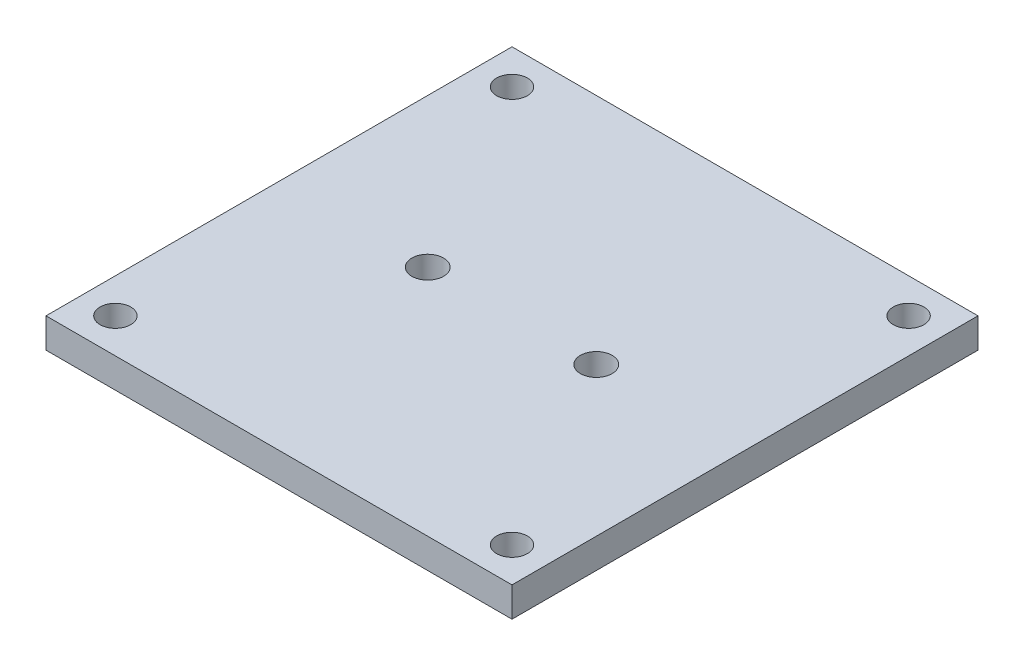
ISO-10303-21;
HEADER;
FILE_DESCRIPTION(('STEP AP214'),'2;1');
FILE_NAME('part.step','',(''),(''),'','','');
FILE_SCHEMA(('AUTOMOTIVE_DESIGN { 1 0 10303 214 1 1 1 1 }'));
ENDSEC;
DATA;
#1=APPLICATION_CONTEXT('core data for automotive mechanical design processes');
#2=APPLICATION_PROTOCOL_DEFINITION('international standard','automotive_design',2000,#1);
#3=PRODUCT_CONTEXT('',#1,'mechanical');
#4=PRODUCT('Part','Part','',(#3));
#5=PRODUCT_RELATED_PRODUCT_CATEGORY('part','',(#4));
#6=PRODUCT_DEFINITION_FORMATION('','',#4);
#7=PRODUCT_DEFINITION_CONTEXT('part definition',#1,'design');
#8=PRODUCT_DEFINITION('design','',#6,#7);
#9=PRODUCT_DEFINITION_SHAPE('','',#8);
#10=(LENGTH_UNIT() NAMED_UNIT(*) SI_UNIT(.MILLI.,.METRE.));
#11=(NAMED_UNIT(*) PLANE_ANGLE_UNIT() SI_UNIT($,.RADIAN.));
#12=(NAMED_UNIT(*) SI_UNIT($,.STERADIAN.) SOLID_ANGLE_UNIT());
#13=UNCERTAINTY_MEASURE_WITH_UNIT(LENGTH_MEASURE(1.E-05),#10,'distance_accuracy_value','');
#14=(GEOMETRIC_REPRESENTATION_CONTEXT(3) GLOBAL_UNCERTAINTY_ASSIGNED_CONTEXT((#13)) GLOBAL_UNIT_ASSIGNED_CONTEXT((#10,
#11,#12)) REPRESENTATION_CONTEXT('',''));
#15=CARTESIAN_POINT('',(0.,0.,0.));
#16=DIRECTION('',(0.,0.,1.));
#17=DIRECTION('',(1.,0.,0.));
#18=AXIS2_PLACEMENT_3D('',#15,#16,#17);
#19=CARTESIAN_POINT('',(23.5,3.,-23.5));
#20=DIRECTION('',(-1.,0.,0.));
#21=DIRECTION('',(0.,0.,1.));
#22=AXIS2_PLACEMENT_3D('',#19,#20,#21);
#23=PLANE('',#22);
#24=DIRECTION('',(0.,0.,-1.));
#25=VECTOR('',#24,1.);
#26=CARTESIAN_POINT('',(23.5,0.,-23.5));
#27=LINE('',#26,#25);
#28=CARTESIAN_POINT('',(23.5,0.,23.5));
#29=VERTEX_POINT('',#28);
#30=CARTESIAN_POINT('',(23.5,0.,-23.5));
#31=VERTEX_POINT('',#30);
#32=EDGE_CURVE('E96',#29,#31,#27,.T.);
#33=ORIENTED_EDGE('',*,*,#32,.T.);
#34=DIRECTION('',(0.,-1.,0.));
#35=VECTOR('',#34,1.);
#36=CARTESIAN_POINT('',(23.5,3.,-23.5));
#37=LINE('',#36,#35);
#38=CARTESIAN_POINT('',(23.5,3.,-23.5));
#39=VERTEX_POINT('',#38);
#40=EDGE_CURVE('E11',#39,#31,#37,.T.);
#41=ORIENTED_EDGE('',*,*,#40,.F.);
#42=DIRECTION('',(0.,0.,-1.));
#43=VECTOR('',#42,1.);
#44=CARTESIAN_POINT('',(23.5,3.,-23.5));
#45=LINE('',#44,#43);
#46=CARTESIAN_POINT('',(23.5,3.,23.5));
#47=VERTEX_POINT('',#46);
#48=EDGE_CURVE('E84',#47,#39,#45,.T.);
#49=ORIENTED_EDGE('',*,*,#48,.F.);
#50=DIRECTION('',(0.,-1.,0.));
#51=VECTOR('',#50,1.);
#52=CARTESIAN_POINT('',(23.5,3.,23.5));
#53=LINE('',#52,#51);
#54=EDGE_CURVE('E92',#47,#29,#53,.T.);
#55=ORIENTED_EDGE('',*,*,#54,.T.);
#56=EDGE_LOOP('',(#33,#41,#49,#55));
#57=FACE_BOUND('',#56,.T.);
#58=ADVANCED_FACE('F33',(#57),#23,.F.);
#59=CARTESIAN_POINT('',(-23.5,3.,-23.5));
#60=DIRECTION('',(0.,0.,1.));
#61=DIRECTION('',(1.,0.,0.));
#62=AXIS2_PLACEMENT_3D('',#59,#60,#61);
#63=PLANE('',#62);
#64=DIRECTION('',(-1.,0.,0.));
#65=VECTOR('',#64,1.);
#66=CARTESIAN_POINT('',(-23.5,0.,-23.5));
#67=LINE('',#66,#65);
#68=CARTESIAN_POINT('',(-23.5,0.,-23.5));
#69=VERTEX_POINT('',#68);
#70=EDGE_CURVE('E88',#31,#69,#67,.T.);
#71=ORIENTED_EDGE('',*,*,#70,.T.);
#72=DIRECTION('',(0.,-1.,0.));
#73=VECTOR('',#72,1.);
#74=CARTESIAN_POINT('',(-23.5,3.,-23.5));
#75=LINE('',#74,#73);
#76=CARTESIAN_POINT('',(-23.5,3.,-23.5));
#77=VERTEX_POINT('',#76);
#78=EDGE_CURVE('E41',#77,#69,#75,.T.);
#79=ORIENTED_EDGE('',*,*,#78,.F.);
#80=DIRECTION('',(-1.,0.,0.));
#81=VECTOR('',#80,1.);
#82=CARTESIAN_POINT('',(-23.5,3.,-23.5));
#83=LINE('',#82,#81);
#84=EDGE_CURVE('E79',#39,#77,#83,.T.);
#85=ORIENTED_EDGE('',*,*,#84,.F.);
#86=ORIENTED_EDGE('',*,*,#40,.T.);
#87=EDGE_LOOP('',(#71,#79,#85,#86));
#88=FACE_BOUND('',#87,.T.);
#89=ADVANCED_FACE('F87',(#88),#63,.F.);
#90=CARTESIAN_POINT('',(-23.5,3.,-23.5));
#91=DIRECTION('',(1.,0.,0.));
#92=DIRECTION('',(0.,0.,-1.));
#93=AXIS2_PLACEMENT_3D('',#90,#91,#92);
#94=PLANE('',#93);
#95=DIRECTION('',(0.,0.,1.));
#96=VECTOR('',#95,1.);
#97=CARTESIAN_POINT('',(-23.5,0.,-23.5));
#98=LINE('',#97,#96);
#99=CARTESIAN_POINT('',(-23.5,0.,23.5));
#100=VERTEX_POINT('',#99);
#101=EDGE_CURVE('E66',#69,#100,#98,.T.);
#102=ORIENTED_EDGE('',*,*,#101,.T.);
#103=DIRECTION('',(0.,-1.,0.));
#104=VECTOR('',#103,1.);
#105=CARTESIAN_POINT('',(-23.5,3.,23.5));
#106=LINE('',#105,#104);
#107=CARTESIAN_POINT('',(-23.5,3.,23.5));
#108=VERTEX_POINT('',#107);
#109=EDGE_CURVE('E89',#108,#100,#106,.T.);
#110=ORIENTED_EDGE('',*,*,#109,.F.);
#111=DIRECTION('',(0.,0.,1.));
#112=VECTOR('',#111,1.);
#113=CARTESIAN_POINT('',(-23.5,3.,-23.5));
#114=LINE('',#113,#112);
#115=EDGE_CURVE('E82',#77,#108,#114,.T.);
#116=ORIENTED_EDGE('',*,*,#115,.F.);
#117=ORIENTED_EDGE('',*,*,#78,.T.);
#118=EDGE_LOOP('',(#102,#110,#116,#117));
#119=FACE_BOUND('',#118,.T.);
#120=ADVANCED_FACE('F90',(#119),#94,.F.);
#121=CARTESIAN_POINT('',(-23.5,3.,23.5));
#122=DIRECTION('',(0.,0.,-1.));
#123=DIRECTION('',(-1.,0.,0.));
#124=AXIS2_PLACEMENT_3D('',#121,#122,#123);
#125=PLANE('',#124);
#126=DIRECTION('',(1.,0.,0.));
#127=VECTOR('',#126,1.);
#128=CARTESIAN_POINT('',(-23.5,0.,23.5));
#129=LINE('',#128,#127);
#130=EDGE_CURVE('E72',#100,#29,#129,.T.);
#131=ORIENTED_EDGE('',*,*,#130,.T.);
#132=ORIENTED_EDGE('',*,*,#54,.F.);
#133=DIRECTION('',(1.,0.,0.));
#134=VECTOR('',#133,1.);
#135=CARTESIAN_POINT('',(-23.5,3.,23.5));
#136=LINE('',#135,#134);
#137=EDGE_CURVE('E49',#108,#47,#136,.T.);
#138=ORIENTED_EDGE('',*,*,#137,.F.);
#139=ORIENTED_EDGE('',*,*,#109,.T.);
#140=EDGE_LOOP('',(#131,#132,#138,#139));
#141=FACE_BOUND('',#140,.T.);
#142=ADVANCED_FACE('F104',(#141),#125,.F.);
#143=CARTESIAN_POINT('',(0.,3.,0.));
#144=DIRECTION('',(0.,1.,0.));
#145=DIRECTION('',(0.,0.,1.));
#146=AXIS2_PLACEMENT_3D('',#143,#144,#145);
#147=PLANE('',#146);
#148=CARTESIAN_POINT('',(-8.5,3.,0.));
#149=DIRECTION('',(0.,1.,0.));
#150=DIRECTION('',(0.,0.,1.));
#151=AXIS2_PLACEMENT_3D('',#148,#149,#150);
#152=CIRCLE('',#151,1.6);
#153=CARTESIAN_POINT('',(-8.5,3.,1.6));
#154=VERTEX_POINT('',#153);
#155=EDGE_CURVE('E140',#154,#154,#152,.T.);
#156=ORIENTED_EDGE('',*,*,#155,.F.);
#157=EDGE_LOOP('',(#156));
#158=FACE_BOUND('',#157,.T.);
#159=CARTESIAN_POINT('',(8.50000000000001,3.,0.));
#160=DIRECTION('',(0.,1.,0.));
#161=DIRECTION('',(0.,0.,-1.));
#162=AXIS2_PLACEMENT_3D('',#159,#160,#161);
#163=CIRCLE('',#162,1.6);
#164=CARTESIAN_POINT('',(8.50000000000001,3.,-1.6));
#165=VERTEX_POINT('',#164);
#166=EDGE_CURVE('E134',#165,#165,#163,.T.);
#167=ORIENTED_EDGE('',*,*,#166,.F.);
#168=EDGE_LOOP('',(#167));
#169=FACE_BOUND('',#168,.T.);
#170=CARTESIAN_POINT('',(-20.,3.,20.));
#171=DIRECTION('',(0.,-1.,0.));
#172=DIRECTION('',(0.,0.,1.));
#173=AXIS2_PLACEMENT_3D('',#170,#171,#172);
#174=CIRCLE('',#173,1.55);
#175=CARTESIAN_POINT('',(-20.,3.,21.55));
#176=VERTEX_POINT('',#175);
#177=EDGE_CURVE('E113',#176,#176,#174,.T.);
#178=ORIENTED_EDGE('',*,*,#177,.T.);
#179=EDGE_LOOP('',(#178));
#180=FACE_BOUND('',#179,.T.);
#181=CARTESIAN_POINT('',(20.,3.,-20.));
#182=DIRECTION('',(0.,-1.,0.));
#183=DIRECTION('',(0.,0.,1.));
#184=AXIS2_PLACEMENT_3D('',#181,#182,#183);
#185=CIRCLE('',#184,1.55);
#186=CARTESIAN_POINT('',(20.,3.,-18.45));
#187=VERTEX_POINT('',#186);
#188=EDGE_CURVE('E119',#187,#187,#185,.T.);
#189=ORIENTED_EDGE('',*,*,#188,.T.);
#190=EDGE_LOOP('',(#189));
#191=FACE_BOUND('',#190,.T.);
#192=CARTESIAN_POINT('',(-20.,3.,-20.));
#193=DIRECTION('',(0.,-1.,0.));
#194=DIRECTION('',(0.,0.,-1.));
#195=AXIS2_PLACEMENT_3D('',#192,#193,#194);
#196=CIRCLE('',#195,1.55);
#197=CARTESIAN_POINT('',(-20.,3.,-21.55));
#198=VERTEX_POINT('',#197);
#199=EDGE_CURVE('E120',#198,#198,#196,.T.);
#200=ORIENTED_EDGE('',*,*,#199,.T.);
#201=EDGE_LOOP('',(#200));
#202=FACE_BOUND('',#201,.T.);
#203=CARTESIAN_POINT('',(20.,3.,20.));
#204=DIRECTION('',(0.,-1.,0.));
#205=DIRECTION('',(0.,0.,-1.));
#206=AXIS2_PLACEMENT_3D('',#203,#204,#205);
#207=CIRCLE('',#206,1.55);
#208=CARTESIAN_POINT('',(20.,3.,18.45));
#209=VERTEX_POINT('',#208);
#210=EDGE_CURVE('E99',#209,#209,#207,.T.);
#211=ORIENTED_EDGE('',*,*,#210,.T.);
#212=EDGE_LOOP('',(#211));
#213=FACE_BOUND('',#212,.T.);
#214=ORIENTED_EDGE('',*,*,#48,.T.);
#215=ORIENTED_EDGE('',*,*,#84,.T.);
#216=ORIENTED_EDGE('',*,*,#115,.T.);
#217=ORIENTED_EDGE('',*,*,#137,.T.);
#218=EDGE_LOOP('',(#214,#215,#216,#217));
#219=FACE_BOUND('',#218,.T.);
#220=ADVANCED_FACE('F80',(#158,#169,#180,#191,#202,#213,#219),#147,.T.);
#221=CARTESIAN_POINT('',(0.,0.,0.));
#222=DIRECTION('',(0.,1.,0.));
#223=DIRECTION('',(0.,0.,1.));
#224=AXIS2_PLACEMENT_3D('',#221,#222,#223);
#225=PLANE('',#224);
#226=CARTESIAN_POINT('',(-8.5,0.,0.));
#227=DIRECTION('',(0.,1.,0.));
#228=DIRECTION('',(0.,0.,1.));
#229=AXIS2_PLACEMENT_3D('',#226,#227,#228);
#230=CIRCLE('',#229,1.6);
#231=CARTESIAN_POINT('',(-8.5,0.,1.6));
#232=VERTEX_POINT('',#231);
#233=EDGE_CURVE('E131',#232,#232,#230,.T.);
#234=ORIENTED_EDGE('',*,*,#233,.T.);
#235=EDGE_LOOP('',(#234));
#236=FACE_BOUND('',#235,.T.);
#237=CARTESIAN_POINT('',(8.50000000000001,0.,0.));
#238=DIRECTION('',(0.,1.,0.));
#239=DIRECTION('',(0.,0.,-1.));
#240=AXIS2_PLACEMENT_3D('',#237,#238,#239);
#241=CIRCLE('',#240,1.6);
#242=CARTESIAN_POINT('',(8.50000000000001,0.,-1.6));
#243=VERTEX_POINT('',#242);
#244=EDGE_CURVE('E137',#243,#243,#241,.T.);
#245=ORIENTED_EDGE('',*,*,#244,.T.);
#246=EDGE_LOOP('',(#245));
#247=FACE_BOUND('',#246,.T.);
#248=CARTESIAN_POINT('',(-20.,0.,20.));
#249=DIRECTION('',(0.,-1.,0.));
#250=DIRECTION('',(0.,0.,1.));
#251=AXIS2_PLACEMENT_3D('',#248,#249,#250);
#252=CIRCLE('',#251,1.55);
#253=CARTESIAN_POINT('',(-20.,0.,21.55));
#254=VERTEX_POINT('',#253);
#255=EDGE_CURVE('E123',#254,#254,#252,.T.);
#256=ORIENTED_EDGE('',*,*,#255,.F.);
#257=EDGE_LOOP('',(#256));
#258=FACE_BOUND('',#257,.T.);
#259=CARTESIAN_POINT('',(20.,0.,-20.));
#260=DIRECTION('',(0.,-1.,0.));
#261=DIRECTION('',(0.,0.,1.));
#262=AXIS2_PLACEMENT_3D('',#259,#260,#261);
#263=CIRCLE('',#262,1.55);
#264=CARTESIAN_POINT('',(20.,0.,-18.45));
#265=VERTEX_POINT('',#264);
#266=EDGE_CURVE('E116',#265,#265,#263,.T.);
#267=ORIENTED_EDGE('',*,*,#266,.F.);
#268=EDGE_LOOP('',(#267));
#269=FACE_BOUND('',#268,.T.);
#270=CARTESIAN_POINT('',(-20.,0.,-20.));
#271=DIRECTION('',(0.,-1.,0.));
#272=DIRECTION('',(0.,0.,-1.));
#273=AXIS2_PLACEMENT_3D('',#270,#271,#272);
#274=CIRCLE('',#273,1.55);
#275=CARTESIAN_POINT('',(-20.,0.,-21.55));
#276=VERTEX_POINT('',#275);
#277=EDGE_CURVE('E128',#276,#276,#274,.T.);
#278=ORIENTED_EDGE('',*,*,#277,.F.);
#279=EDGE_LOOP('',(#278));
#280=FACE_BOUND('',#279,.T.);
#281=CARTESIAN_POINT('',(20.,0.,20.));
#282=DIRECTION('',(0.,-1.,0.));
#283=DIRECTION('',(0.,0.,-1.));
#284=AXIS2_PLACEMENT_3D('',#281,#282,#283);
#285=CIRCLE('',#284,1.55);
#286=CARTESIAN_POINT('',(20.,0.,18.45));
#287=VERTEX_POINT('',#286);
#288=EDGE_CURVE('E110',#287,#287,#285,.T.);
#289=ORIENTED_EDGE('',*,*,#288,.F.);
#290=EDGE_LOOP('',(#289));
#291=FACE_BOUND('',#290,.T.);
#292=ORIENTED_EDGE('',*,*,#32,.F.);
#293=ORIENTED_EDGE('',*,*,#130,.F.);
#294=ORIENTED_EDGE('',*,*,#101,.F.);
#295=ORIENTED_EDGE('',*,*,#70,.F.);
#296=EDGE_LOOP('',(#292,#293,#294,#295));
#297=FACE_BOUND('',#296,.T.);
#298=ADVANCED_FACE('F107',(#236,#247,#258,#269,#280,#291,#297),#225,.F.);
#299=CARTESIAN_POINT('',(20.,3.,20.));
#300=DIRECTION('',(0.,-1.,0.));
#301=DIRECTION('',(0.,0.,-1.));
#302=AXIS2_PLACEMENT_3D('',#299,#300,#301);
#303=CYLINDRICAL_SURFACE('',#302,1.55);
#304=ORIENTED_EDGE('',*,*,#210,.F.);
#305=EDGE_LOOP('',(#304));
#306=FACE_BOUND('',#305,.T.);
#307=ORIENTED_EDGE('',*,*,#288,.T.);
#308=EDGE_LOOP('',(#307));
#309=FACE_BOUND('',#308,.T.);
#310=ADVANCED_FACE('F168',(#306,#309),#303,.F.);
#311=CARTESIAN_POINT('',(-20.,3.,-20.));
#312=DIRECTION('',(0.,-1.,0.));
#313=DIRECTION('',(0.,0.,-1.));
#314=AXIS2_PLACEMENT_3D('',#311,#312,#313);
#315=CYLINDRICAL_SURFACE('',#314,1.55);
#316=ORIENTED_EDGE('',*,*,#199,.F.);
#317=EDGE_LOOP('',(#316));
#318=FACE_BOUND('',#317,.T.);
#319=ORIENTED_EDGE('',*,*,#277,.T.);
#320=EDGE_LOOP('',(#319));
#321=FACE_BOUND('',#320,.T.);
#322=ADVANCED_FACE('F171',(#318,#321),#315,.F.);
#323=CARTESIAN_POINT('',(20.,3.,-20.));
#324=DIRECTION('',(0.,-1.,0.));
#325=DIRECTION('',(0.,0.,-1.));
#326=AXIS2_PLACEMENT_3D('',#323,#324,#325);
#327=CYLINDRICAL_SURFACE('',#326,1.55);
#328=ORIENTED_EDGE('',*,*,#188,.F.);
#329=EDGE_LOOP('',(#328));
#330=FACE_BOUND('',#329,.T.);
#331=ORIENTED_EDGE('',*,*,#266,.T.);
#332=EDGE_LOOP('',(#331));
#333=FACE_BOUND('',#332,.T.);
#334=ADVANCED_FACE('F215',(#330,#333),#327,.F.);
#335=CARTESIAN_POINT('',(-20.,3.,20.));
#336=DIRECTION('',(0.,-1.,0.));
#337=DIRECTION('',(0.,0.,-1.));
#338=AXIS2_PLACEMENT_3D('',#335,#336,#337);
#339=CYLINDRICAL_SURFACE('',#338,1.55);
#340=ORIENTED_EDGE('',*,*,#177,.F.);
#341=EDGE_LOOP('',(#340));
#342=FACE_BOUND('',#341,.T.);
#343=ORIENTED_EDGE('',*,*,#255,.T.);
#344=EDGE_LOOP('',(#343));
#345=FACE_BOUND('',#344,.T.);
#346=ADVANCED_FACE('F223',(#342,#345),#339,.F.);
#347=CARTESIAN_POINT('',(8.50000000000001,0.,0.));
#348=DIRECTION('',(0.,1.,0.));
#349=DIRECTION('',(0.,0.,1.));
#350=AXIS2_PLACEMENT_3D('',#347,#348,#349);
#351=CYLINDRICAL_SURFACE('',#350,1.6);
#352=ORIENTED_EDGE('',*,*,#244,.F.);
#353=EDGE_LOOP('',(#352));
#354=FACE_BOUND('',#353,.T.);
#355=ORIENTED_EDGE('',*,*,#166,.T.);
#356=EDGE_LOOP('',(#355));
#357=FACE_BOUND('',#356,.T.);
#358=ADVANCED_FACE('F151',(#354,#357),#351,.F.);
#359=CARTESIAN_POINT('',(-8.5,0.,0.));
#360=DIRECTION('',(0.,1.,0.));
#361=DIRECTION('',(0.,0.,1.));
#362=AXIS2_PLACEMENT_3D('',#359,#360,#361);
#363=CYLINDRICAL_SURFACE('',#362,1.6);
#364=ORIENTED_EDGE('',*,*,#233,.F.);
#365=EDGE_LOOP('',(#364));
#366=FACE_BOUND('',#365,.T.);
#367=ORIENTED_EDGE('',*,*,#155,.T.);
#368=EDGE_LOOP('',(#367));
#369=FACE_BOUND('',#368,.T.);
#370=ADVANCED_FACE('F148',(#366,#369),#363,.F.);
#371=CLOSED_SHELL('',(#58,#89,#120,#142,#220,#298,#310,#322,#334,#346,#358,#370));
#372=MANIFOLD_SOLID_BREP('B2',#371);
#373=ADVANCED_BREP_SHAPE_REPRESENTATION('',(#18,#372),#14);
#374=SHAPE_DEFINITION_REPRESENTATION(#9,#373);
ENDSEC;
END-ISO-10303-21;
